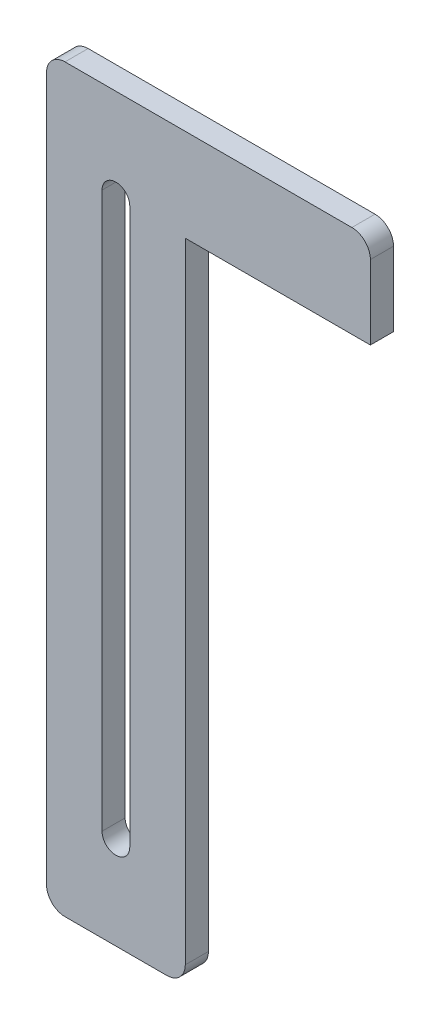
ISO-10303-21;
HEADER;
FILE_DESCRIPTION(('STEP AP214'),'2;1');
FILE_NAME('part.step','',(''),(''),'','','');
FILE_SCHEMA(('AUTOMOTIVE_DESIGN { 1 0 10303 214 1 1 1 1 }'));
ENDSEC;
DATA;
#1=APPLICATION_CONTEXT('core data for automotive mechanical design processes');
#2=APPLICATION_PROTOCOL_DEFINITION('international standard','automotive_design',2000,#1);
#3=PRODUCT_CONTEXT('',#1,'mechanical');
#4=PRODUCT('Part','Part','',(#3));
#5=PRODUCT_RELATED_PRODUCT_CATEGORY('part','',(#4));
#6=PRODUCT_DEFINITION_FORMATION('','',#4);
#7=PRODUCT_DEFINITION_CONTEXT('part definition',#1,'design');
#8=PRODUCT_DEFINITION('design','',#6,#7);
#9=PRODUCT_DEFINITION_SHAPE('','',#8);
#10=(LENGTH_UNIT() NAMED_UNIT(*) SI_UNIT(.MILLI.,.METRE.));
#11=(NAMED_UNIT(*) PLANE_ANGLE_UNIT() SI_UNIT($,.RADIAN.));
#12=(NAMED_UNIT(*) SI_UNIT($,.STERADIAN.) SOLID_ANGLE_UNIT());
#13=UNCERTAINTY_MEASURE_WITH_UNIT(LENGTH_MEASURE(1.E-05),#10,'distance_accuracy_value','');
#14=(GEOMETRIC_REPRESENTATION_CONTEXT(3) GLOBAL_UNCERTAINTY_ASSIGNED_CONTEXT((#13)) GLOBAL_UNIT_ASSIGNED_CONTEXT((#10,
#11,#12)) REPRESENTATION_CONTEXT('',''));
#15=CARTESIAN_POINT('',(0.,0.,0.));
#16=DIRECTION('',(0.,0.,1.));
#17=DIRECTION('',(1.,0.,0.));
#18=AXIS2_PLACEMENT_3D('',#15,#16,#17);
#19=CARTESIAN_POINT('',(0.,0.,3.175));
#20=DIRECTION('',(0.,0.,1.));
#21=DIRECTION('',(1.,0.,0.));
#22=AXIS2_PLACEMENT_3D('',#19,#20,#21);
#23=PLANE('',#22);
#24=DIRECTION('',(1.,0.,0.));
#25=VECTOR('',#24,1.);
#26=CARTESIAN_POINT('',(0.,0.,3.175));
#27=LINE('',#26,#25);
#28=CARTESIAN_POINT('',(2.54,0.,3.175));
#29=VERTEX_POINT('',#28);
#30=CARTESIAN_POINT('',(16.51,0.,3.175));
#31=VERTEX_POINT('',#30);
#32=EDGE_CURVE('E237',#29,#31,#27,.T.);
#33=ORIENTED_EDGE('',*,*,#32,.T.);
#34=CARTESIAN_POINT('',(16.51,2.54,3.175));
#35=DIRECTION('',(0.,0.,1.));
#36=DIRECTION('',(1.,0.,0.));
#37=AXIS2_PLACEMENT_3D('',#34,#35,#36);
#38=CIRCLE('',#37,2.54);
#39=CARTESIAN_POINT('',(19.05,2.54,3.175));
#40=VERTEX_POINT('',#39);
#41=EDGE_CURVE('E192',#31,#40,#38,.T.);
#42=ORIENTED_EDGE('',*,*,#41,.T.);
#43=DIRECTION('',(0.,1.,0.));
#44=VECTOR('',#43,1.);
#45=CARTESIAN_POINT('',(19.05,0.,3.175));
#46=LINE('',#45,#44);
#47=CARTESIAN_POINT('',(19.05,88.9,3.175));
#48=VERTEX_POINT('',#47);
#49=EDGE_CURVE('E183',#40,#48,#46,.T.);
#50=ORIENTED_EDGE('',*,*,#49,.T.);
#51=DIRECTION('',(1.,0.,0.));
#52=VECTOR('',#51,1.);
#53=CARTESIAN_POINT('',(0.,88.9,3.175));
#54=LINE('',#53,#52);
#55=CARTESIAN_POINT('',(44.45,88.9,3.175));
#56=VERTEX_POINT('',#55);
#57=EDGE_CURVE('E189',#48,#56,#54,.T.);
#58=ORIENTED_EDGE('',*,*,#57,.T.);
#59=DIRECTION('',(0.,-1.,0.));
#60=VECTOR('',#59,1.);
#61=CARTESIAN_POINT('',(44.45,0.,3.175));
#62=LINE('',#61,#60);
#63=CARTESIAN_POINT('',(44.45,99.06,3.175));
#64=VERTEX_POINT('',#63);
#65=EDGE_CURVE('E216',#64,#56,#62,.T.);
#66=ORIENTED_EDGE('',*,*,#65,.F.);
#67=CARTESIAN_POINT('',(41.91,99.06,3.175));
#68=DIRECTION('',(0.,0.,1.));
#69=DIRECTION('',(1.,0.,0.));
#70=AXIS2_PLACEMENT_3D('',#67,#68,#69);
#71=CIRCLE('',#70,2.54);
#72=CARTESIAN_POINT('',(41.91,101.6,3.175));
#73=VERTEX_POINT('',#72);
#74=EDGE_CURVE('E258',#64,#73,#71,.T.);
#75=ORIENTED_EDGE('',*,*,#74,.T.);
#76=DIRECTION('',(1.,0.,0.));
#77=VECTOR('',#76,1.);
#78=CARTESIAN_POINT('',(0.,101.6,3.175));
#79=LINE('',#78,#77);
#80=CARTESIAN_POINT('',(2.53999999999998,101.6,3.175));
#81=VERTEX_POINT('',#80);
#82=EDGE_CURVE('E212',#81,#73,#79,.T.);
#83=ORIENTED_EDGE('',*,*,#82,.F.);
#84=CARTESIAN_POINT('',(2.53999999999998,99.06,3.175));
#85=DIRECTION('',(0.,0.,1.));
#86=DIRECTION('',(1.,0.,0.));
#87=AXIS2_PLACEMENT_3D('',#84,#85,#86);
#88=CIRCLE('',#87,2.54);
#89=CARTESIAN_POINT('',(0.,99.06,3.175));
#90=VERTEX_POINT('',#89);
#91=EDGE_CURVE('E97',#81,#90,#88,.T.);
#92=ORIENTED_EDGE('',*,*,#91,.T.);
#93=DIRECTION('',(0.,1.,0.));
#94=VECTOR('',#93,1.);
#95=CARTESIAN_POINT('',(0.,0.,3.175));
#96=LINE('',#95,#94);
#97=CARTESIAN_POINT('',(0.,2.54,3.175));
#98=VERTEX_POINT('',#97);
#99=EDGE_CURVE('E196',#98,#90,#96,.T.);
#100=ORIENTED_EDGE('',*,*,#99,.F.);
#101=CARTESIAN_POINT('',(2.54,2.54,3.175));
#102=DIRECTION('',(0.,0.,1.));
#103=DIRECTION('',(1.,0.,0.));
#104=AXIS2_PLACEMENT_3D('',#101,#102,#103);
#105=CIRCLE('',#104,2.54);
#106=EDGE_CURVE('E264',#98,#29,#105,.T.);
#107=ORIENTED_EDGE('',*,*,#106,.T.);
#108=EDGE_LOOP('',(#33,#42,#50,#58,#66,#75,#83,#92,#100,#107));
#109=FACE_BOUND('',#108,.T.);
#110=DIRECTION('',(0.,-1.,0.));
#111=VECTOR('',#110,1.);
#112=CARTESIAN_POINT('',(7.62,0.,3.175));
#113=LINE('',#112,#111);
#114=CARTESIAN_POINT('',(7.61999999999999,88.9,3.175));
#115=VERTEX_POINT('',#114);
#116=CARTESIAN_POINT('',(7.62,12.7,3.175));
#117=VERTEX_POINT('',#116);
#118=EDGE_CURVE('E290',#115,#117,#113,.T.);
#119=ORIENTED_EDGE('',*,*,#118,.F.);
#120=CARTESIAN_POINT('',(9.52499999999999,88.9,3.175));
#121=DIRECTION('',(0.,0.,1.));
#122=DIRECTION('',(1.,0.,0.));
#123=AXIS2_PLACEMENT_3D('',#120,#121,#122);
#124=CIRCLE('',#123,1.905);
#125=CARTESIAN_POINT('',(11.43,88.9,3.175));
#126=VERTEX_POINT('',#125);
#127=EDGE_CURVE('E298',#126,#115,#124,.T.);
#128=ORIENTED_EDGE('',*,*,#127,.F.);
#129=DIRECTION('',(0.,-1.,0.));
#130=VECTOR('',#129,1.);
#131=CARTESIAN_POINT('',(11.43,0.,3.175));
#132=LINE('',#131,#130);
#133=CARTESIAN_POINT('',(11.43,12.7,3.175));
#134=VERTEX_POINT('',#133);
#135=EDGE_CURVE('E295',#126,#134,#132,.T.);
#136=ORIENTED_EDGE('',*,*,#135,.T.);
#137=CARTESIAN_POINT('',(9.525,12.7,3.175));
#138=DIRECTION('',(0.,0.,1.));
#139=DIRECTION('',(1.,0.,0.));
#140=AXIS2_PLACEMENT_3D('',#137,#138,#139);
#141=CIRCLE('',#140,1.905);
#142=EDGE_CURVE('E292',#117,#134,#141,.T.);
#143=ORIENTED_EDGE('',*,*,#142,.F.);
#144=EDGE_LOOP('',(#119,#128,#136,#143));
#145=FACE_BOUND('',#144,.T.);
#146=ADVANCED_FACE('F82',(#109,#145),#23,.T.);
#147=CARTESIAN_POINT('',(44.45,0.,3.175));
#148=DIRECTION('',(1.,0.,0.));
#149=DIRECTION('',(0.,0.,-1.));
#150=AXIS2_PLACEMENT_3D('',#147,#148,#149);
#151=PLANE('',#150);
#152=DIRECTION('',(0.,-1.,0.));
#153=VECTOR('',#152,1.);
#154=CARTESIAN_POINT('',(44.45,0.,0.));
#155=LINE('',#154,#153);
#156=CARTESIAN_POINT('',(44.45,99.06,0.));
#157=VERTEX_POINT('',#156);
#158=CARTESIAN_POINT('',(44.45,88.9,0.));
#159=VERTEX_POINT('',#158);
#160=EDGE_CURVE('E238',#157,#159,#155,.T.);
#161=ORIENTED_EDGE('',*,*,#160,.F.);
#162=DIRECTION('',(0.,0.,-1.));
#163=VECTOR('',#162,1.);
#164=CARTESIAN_POINT('',(44.45,99.06,3.175));
#165=LINE('',#164,#163);
#166=EDGE_CURVE('E12',#157,#64,#165,.F.);
#167=ORIENTED_EDGE('',*,*,#166,.T.);
#168=ORIENTED_EDGE('',*,*,#65,.T.);
#169=DIRECTION('',(0.,0.,-1.));
#170=VECTOR('',#169,1.);
#171=CARTESIAN_POINT('',(44.45,88.9,3.175));
#172=LINE('',#171,#170);
#173=EDGE_CURVE('E208',#56,#159,#172,.T.);
#174=ORIENTED_EDGE('',*,*,#173,.T.);
#175=EDGE_LOOP('',(#161,#167,#168,#174));
#176=FACE_BOUND('',#175,.T.);
#177=ADVANCED_FACE('F343',(#176),#151,.T.);
#178=CARTESIAN_POINT('',(0.,0.,0.));
#179=DIRECTION('',(0.,0.,1.));
#180=DIRECTION('',(1.,0.,0.));
#181=AXIS2_PLACEMENT_3D('',#178,#179,#180);
#182=PLANE('',#181);
#183=DIRECTION('',(0.,1.,0.));
#184=VECTOR('',#183,1.);
#185=CARTESIAN_POINT('',(19.05,0.,0.));
#186=LINE('',#185,#184);
#187=CARTESIAN_POINT('',(19.05,2.54,0.));
#188=VERTEX_POINT('',#187);
#189=CARTESIAN_POINT('',(19.05,88.9,0.));
#190=VERTEX_POINT('',#189);
#191=EDGE_CURVE('E203',#188,#190,#186,.T.);
#192=ORIENTED_EDGE('',*,*,#191,.F.);
#193=CARTESIAN_POINT('',(16.51,2.54,0.));
#194=DIRECTION('',(0.,0.,1.));
#195=DIRECTION('',(1.,0.,0.));
#196=AXIS2_PLACEMENT_3D('',#193,#194,#195);
#197=CIRCLE('',#196,2.54);
#198=CARTESIAN_POINT('',(16.51,0.,0.));
#199=VERTEX_POINT('',#198);
#200=EDGE_CURVE('E256',#188,#199,#197,.F.);
#201=ORIENTED_EDGE('',*,*,#200,.T.);
#202=DIRECTION('',(1.,0.,0.));
#203=VECTOR('',#202,1.);
#204=CARTESIAN_POINT('',(0.,0.,0.));
#205=LINE('',#204,#203);
#206=CARTESIAN_POINT('',(2.54,0.,0.));
#207=VERTEX_POINT('',#206);
#208=EDGE_CURVE('E197',#207,#199,#205,.T.);
#209=ORIENTED_EDGE('',*,*,#208,.F.);
#210=CARTESIAN_POINT('',(2.54,2.54,0.));
#211=DIRECTION('',(0.,0.,1.));
#212=DIRECTION('',(1.,0.,0.));
#213=AXIS2_PLACEMENT_3D('',#210,#211,#212);
#214=CIRCLE('',#213,2.54);
#215=CARTESIAN_POINT('',(0.,2.54,0.));
#216=VERTEX_POINT('',#215);
#217=EDGE_CURVE('E377',#207,#216,#214,.F.);
#218=ORIENTED_EDGE('',*,*,#217,.T.);
#219=DIRECTION('',(0.,1.,0.));
#220=VECTOR('',#219,1.);
#221=CARTESIAN_POINT('',(0.,0.,0.));
#222=LINE('',#221,#220);
#223=CARTESIAN_POINT('',(0.,99.06,0.));
#224=VERTEX_POINT('',#223);
#225=EDGE_CURVE('E241',#216,#224,#222,.T.);
#226=ORIENTED_EDGE('',*,*,#225,.T.);
#227=CARTESIAN_POINT('',(2.53999999999998,99.06,0.));
#228=DIRECTION('',(0.,0.,1.));
#229=DIRECTION('',(1.,0.,0.));
#230=AXIS2_PLACEMENT_3D('',#227,#228,#229);
#231=CIRCLE('',#230,2.54);
#232=CARTESIAN_POINT('',(2.53999999999998,101.6,0.));
#233=VERTEX_POINT('',#232);
#234=EDGE_CURVE('E285',#224,#233,#231,.F.);
#235=ORIENTED_EDGE('',*,*,#234,.T.);
#236=DIRECTION('',(1.,0.,0.));
#237=VECTOR('',#236,1.);
#238=CARTESIAN_POINT('',(0.,101.6,0.));
#239=LINE('',#238,#237);
#240=CARTESIAN_POINT('',(41.91,101.6,0.));
#241=VERTEX_POINT('',#240);
#242=EDGE_CURVE('E225',#233,#241,#239,.T.);
#243=ORIENTED_EDGE('',*,*,#242,.T.);
#244=CARTESIAN_POINT('',(41.91,99.06,0.));
#245=DIRECTION('',(0.,0.,1.));
#246=DIRECTION('',(1.,0.,0.));
#247=AXIS2_PLACEMENT_3D('',#244,#245,#246);
#248=CIRCLE('',#247,2.54);
#249=EDGE_CURVE('E283',#241,#157,#248,.F.);
#250=ORIENTED_EDGE('',*,*,#249,.T.);
#251=ORIENTED_EDGE('',*,*,#160,.T.);
#252=DIRECTION('',(1.,0.,0.));
#253=VECTOR('',#252,1.);
#254=CARTESIAN_POINT('',(0.,88.9,0.));
#255=LINE('',#254,#253);
#256=EDGE_CURVE('E223',#190,#159,#255,.T.);
#257=ORIENTED_EDGE('',*,*,#256,.F.);
#258=EDGE_LOOP('',(#192,#201,#209,#218,#226,#235,#243,#250,#251,#257));
#259=FACE_BOUND('',#258,.T.);
#260=CARTESIAN_POINT('',(9.52499999999999,88.9,0.));
#261=DIRECTION('',(0.,0.,1.));
#262=DIRECTION('',(1.,0.,0.));
#263=AXIS2_PLACEMENT_3D('',#260,#261,#262);
#264=CIRCLE('',#263,1.905);
#265=CARTESIAN_POINT('',(11.43,88.9,0.));
#266=VERTEX_POINT('',#265);
#267=CARTESIAN_POINT('',(7.61999999999999,88.9,0.));
#268=VERTEX_POINT('',#267);
#269=EDGE_CURVE('E293',#266,#268,#264,.T.);
#270=ORIENTED_EDGE('',*,*,#269,.T.);
#271=DIRECTION('',(0.,-1.,0.));
#272=VECTOR('',#271,1.);
#273=CARTESIAN_POINT('',(7.62,0.,0.));
#274=LINE('',#273,#272);
#275=CARTESIAN_POINT('',(7.62,12.7,0.));
#276=VERTEX_POINT('',#275);
#277=EDGE_CURVE('E301',#268,#276,#274,.T.);
#278=ORIENTED_EDGE('',*,*,#277,.T.);
#279=CARTESIAN_POINT('',(9.525,12.7,0.));
#280=DIRECTION('',(0.,0.,1.));
#281=DIRECTION('',(1.,0.,0.));
#282=AXIS2_PLACEMENT_3D('',#279,#280,#281);
#283=CIRCLE('',#282,1.905);
#284=CARTESIAN_POINT('',(11.43,12.7,0.));
#285=VERTEX_POINT('',#284);
#286=EDGE_CURVE('E304',#276,#285,#283,.T.);
#287=ORIENTED_EDGE('',*,*,#286,.T.);
#288=DIRECTION('',(0.,-1.,0.));
#289=VECTOR('',#288,1.);
#290=CARTESIAN_POINT('',(11.43,0.,0.));
#291=LINE('',#290,#289);
#292=EDGE_CURVE('E307',#266,#285,#291,.T.);
#293=ORIENTED_EDGE('',*,*,#292,.F.);
#294=EDGE_LOOP('',(#270,#278,#287,#293));
#295=FACE_BOUND('',#294,.T.);
#296=ADVANCED_FACE('F281',(#259,#295),#182,.F.);
#297=CARTESIAN_POINT('',(0.,88.9,3.175));
#298=DIRECTION('',(0.,1.,0.));
#299=DIRECTION('',(-1.,0.,0.));
#300=AXIS2_PLACEMENT_3D('',#297,#298,#299);
#301=PLANE('',#300);
#302=ORIENTED_EDGE('',*,*,#256,.T.);
#303=ORIENTED_EDGE('',*,*,#173,.F.);
#304=ORIENTED_EDGE('',*,*,#57,.F.);
#305=DIRECTION('',(0.,0.,-1.));
#306=VECTOR('',#305,1.);
#307=CARTESIAN_POINT('',(19.05,88.9,3.175));
#308=LINE('',#307,#306);
#309=EDGE_CURVE('E200',#48,#190,#308,.T.);
#310=ORIENTED_EDGE('',*,*,#309,.T.);
#311=EDGE_LOOP('',(#302,#303,#304,#310));
#312=FACE_BOUND('',#311,.T.);
#313=ADVANCED_FACE('F210',(#312),#301,.F.);
#314=CARTESIAN_POINT('',(0.,101.6,3.175));
#315=DIRECTION('',(0.,1.,0.));
#316=DIRECTION('',(0.,0.,1.));
#317=AXIS2_PLACEMENT_3D('',#314,#315,#316);
#318=PLANE('',#317);
#319=ORIENTED_EDGE('',*,*,#82,.T.);
#320=DIRECTION('',(0.,0.,-1.));
#321=VECTOR('',#320,1.);
#322=CARTESIAN_POINT('',(41.91,101.6,3.175));
#323=LINE('',#322,#321);
#324=EDGE_CURVE('E90',#73,#241,#323,.T.);
#325=ORIENTED_EDGE('',*,*,#324,.T.);
#326=ORIENTED_EDGE('',*,*,#242,.F.);
#327=DIRECTION('',(0.,0.,-1.));
#328=VECTOR('',#327,1.);
#329=CARTESIAN_POINT('',(2.53999999999998,101.6,3.175));
#330=LINE('',#329,#328);
#331=EDGE_CURVE('E271',#233,#81,#330,.F.);
#332=ORIENTED_EDGE('',*,*,#331,.T.);
#333=EDGE_LOOP('',(#319,#325,#326,#332));
#334=FACE_BOUND('',#333,.T.);
#335=ADVANCED_FACE('F277',(#334),#318,.T.);
#336=CARTESIAN_POINT('',(9.525,12.7,3.175));
#337=DIRECTION('',(0.,0.,-1.));
#338=DIRECTION('',(-1.,0.,0.));
#339=AXIS2_PLACEMENT_3D('',#336,#337,#338);
#340=CYLINDRICAL_SURFACE('',#339,1.905);
#341=ORIENTED_EDGE('',*,*,#286,.F.);
#342=DIRECTION('',(0.,0.,-1.));
#343=VECTOR('',#342,1.);
#344=CARTESIAN_POINT('',(7.62,12.7,3.175));
#345=LINE('',#344,#343);
#346=EDGE_CURVE('E234',#117,#276,#345,.T.);
#347=ORIENTED_EDGE('',*,*,#346,.F.);
#348=ORIENTED_EDGE('',*,*,#142,.T.);
#349=DIRECTION('',(0.,0.,-1.));
#350=VECTOR('',#349,1.);
#351=CARTESIAN_POINT('',(11.43,12.7,3.175));
#352=LINE('',#351,#350);
#353=EDGE_CURVE('E315',#134,#285,#352,.T.);
#354=ORIENTED_EDGE('',*,*,#353,.T.);
#355=EDGE_LOOP('',(#341,#347,#348,#354));
#356=FACE_BOUND('',#355,.T.);
#357=ADVANCED_FACE('F331',(#356),#340,.F.);
#358=CARTESIAN_POINT('',(11.43,0.,3.175));
#359=DIRECTION('',(1.,0.,0.));
#360=DIRECTION('',(0.,1.,0.));
#361=AXIS2_PLACEMENT_3D('',#358,#359,#360);
#362=PLANE('',#361);
#363=ORIENTED_EDGE('',*,*,#292,.T.);
#364=ORIENTED_EDGE('',*,*,#353,.F.);
#365=ORIENTED_EDGE('',*,*,#135,.F.);
#366=DIRECTION('',(0.,0.,-1.));
#367=VECTOR('',#366,1.);
#368=CARTESIAN_POINT('',(11.43,88.9,3.175));
#369=LINE('',#368,#367);
#370=EDGE_CURVE('E314',#126,#266,#369,.T.);
#371=ORIENTED_EDGE('',*,*,#370,.T.);
#372=EDGE_LOOP('',(#363,#364,#365,#371));
#373=FACE_BOUND('',#372,.T.);
#374=ADVANCED_FACE('F333',(#373),#362,.F.);
#375=CARTESIAN_POINT('',(9.52499999999999,88.9,3.175));
#376=DIRECTION('',(0.,0.,-1.));
#377=DIRECTION('',(-1.,0.,0.));
#378=AXIS2_PLACEMENT_3D('',#375,#376,#377);
#379=CYLINDRICAL_SURFACE('',#378,1.905);
#380=ORIENTED_EDGE('',*,*,#269,.F.);
#381=ORIENTED_EDGE('',*,*,#370,.F.);
#382=ORIENTED_EDGE('',*,*,#127,.T.);
#383=DIRECTION('',(0.,0.,-1.));
#384=VECTOR('',#383,1.);
#385=CARTESIAN_POINT('',(7.61999999999999,88.9,3.175));
#386=LINE('',#385,#384);
#387=EDGE_CURVE('E300',#115,#268,#386,.T.);
#388=ORIENTED_EDGE('',*,*,#387,.T.);
#389=EDGE_LOOP('',(#380,#381,#382,#388));
#390=FACE_BOUND('',#389,.T.);
#391=ADVANCED_FACE('F329',(#390),#379,.F.);
#392=CARTESIAN_POINT('',(7.62,0.,3.175));
#393=DIRECTION('',(1.,0.,0.));
#394=DIRECTION('',(0.,1.,0.));
#395=AXIS2_PLACEMENT_3D('',#392,#393,#394);
#396=PLANE('',#395);
#397=ORIENTED_EDGE('',*,*,#277,.F.);
#398=ORIENTED_EDGE('',*,*,#387,.F.);
#399=ORIENTED_EDGE('',*,*,#118,.T.);
#400=ORIENTED_EDGE('',*,*,#346,.T.);
#401=EDGE_LOOP('',(#397,#398,#399,#400));
#402=FACE_BOUND('',#401,.T.);
#403=ADVANCED_FACE('F321',(#402),#396,.T.);
#404=CARTESIAN_POINT('',(0.,0.,3.175));
#405=DIRECTION('',(-1.,0.,0.));
#406=DIRECTION('',(0.,-1.,0.));
#407=AXIS2_PLACEMENT_3D('',#404,#405,#406);
#408=PLANE('',#407);
#409=ORIENTED_EDGE('',*,*,#225,.F.);
#410=DIRECTION('',(0.,0.,-1.));
#411=VECTOR('',#410,1.);
#412=CARTESIAN_POINT('',(0.,2.54,3.175));
#413=LINE('',#412,#411);
#414=EDGE_CURVE('E104',#216,#98,#413,.F.);
#415=ORIENTED_EDGE('',*,*,#414,.T.);
#416=ORIENTED_EDGE('',*,*,#99,.T.);
#417=DIRECTION('',(0.,0.,-1.));
#418=VECTOR('',#417,1.);
#419=CARTESIAN_POINT('',(0.,99.06,3.175));
#420=LINE('',#419,#418);
#421=EDGE_CURVE('E267',#90,#224,#420,.T.);
#422=ORIENTED_EDGE('',*,*,#421,.T.);
#423=EDGE_LOOP('',(#409,#415,#416,#422));
#424=FACE_BOUND('',#423,.T.);
#425=ADVANCED_FACE('F360',(#424),#408,.T.);
#426=CARTESIAN_POINT('',(0.,0.,3.175));
#427=DIRECTION('',(0.,1.,0.));
#428=DIRECTION('',(-1.,0.,0.));
#429=AXIS2_PLACEMENT_3D('',#426,#427,#428);
#430=PLANE('',#429);
#431=ORIENTED_EDGE('',*,*,#208,.T.);
#432=DIRECTION('',(0.,0.,-1.));
#433=VECTOR('',#432,1.);
#434=CARTESIAN_POINT('',(16.51,0.,3.175));
#435=LINE('',#434,#433);
#436=EDGE_CURVE('E250',#199,#31,#435,.F.);
#437=ORIENTED_EDGE('',*,*,#436,.T.);
#438=ORIENTED_EDGE('',*,*,#32,.F.);
#439=DIRECTION('',(0.,0.,-1.));
#440=VECTOR('',#439,1.);
#441=CARTESIAN_POINT('',(2.54,0.,0.));
#442=LINE('',#441,#440);
#443=EDGE_CURVE('E252',#29,#207,#442,.T.);
#444=ORIENTED_EDGE('',*,*,#443,.T.);
#445=EDGE_LOOP('',(#431,#437,#438,#444));
#446=FACE_BOUND('',#445,.T.);
#447=ADVANCED_FACE('F248',(#446),#430,.F.);
#448=CARTESIAN_POINT('',(19.05,0.,3.175));
#449=DIRECTION('',(-1.,0.,0.));
#450=DIRECTION('',(0.,-1.,0.));
#451=AXIS2_PLACEMENT_3D('',#448,#449,#450);
#452=PLANE('',#451);
#453=ORIENTED_EDGE('',*,*,#49,.F.);
#454=DIRECTION('',(0.,0.,-1.));
#455=VECTOR('',#454,1.);
#456=CARTESIAN_POINT('',(19.05,2.54,3.175));
#457=LINE('',#456,#455);
#458=EDGE_CURVE('E207',#40,#188,#457,.T.);
#459=ORIENTED_EDGE('',*,*,#458,.T.);
#460=ORIENTED_EDGE('',*,*,#191,.T.);
#461=ORIENTED_EDGE('',*,*,#309,.F.);
#462=EDGE_LOOP('',(#453,#459,#460,#461));
#463=FACE_BOUND('',#462,.T.);
#464=ADVANCED_FACE('F201',(#463),#452,.F.);
#465=CARTESIAN_POINT('',(16.51,2.54,3.175));
#466=DIRECTION('',(0.,0.,-1.));
#467=DIRECTION('',(-1.,0.,0.));
#468=AXIS2_PLACEMENT_3D('',#465,#466,#467);
#469=CYLINDRICAL_SURFACE('',#468,2.54);
#470=ORIENTED_EDGE('',*,*,#41,.F.);
#471=ORIENTED_EDGE('',*,*,#436,.F.);
#472=ORIENTED_EDGE('',*,*,#200,.F.);
#473=ORIENTED_EDGE('',*,*,#458,.F.);
#474=EDGE_LOOP('',(#470,#471,#472,#473));
#475=FACE_BOUND('',#474,.T.);
#476=ADVANCED_FACE('F255',(#475),#469,.T.);
#477=CARTESIAN_POINT('',(2.54,2.54,3.175));
#478=DIRECTION('',(0.,0.,1.));
#479=DIRECTION('',(1.,0.,0.));
#480=AXIS2_PLACEMENT_3D('',#477,#478,#479);
#481=CYLINDRICAL_SURFACE('',#480,2.54);
#482=ORIENTED_EDGE('',*,*,#106,.F.);
#483=ORIENTED_EDGE('',*,*,#414,.F.);
#484=ORIENTED_EDGE('',*,*,#217,.F.);
#485=ORIENTED_EDGE('',*,*,#443,.F.);
#486=EDGE_LOOP('',(#482,#483,#484,#485));
#487=FACE_BOUND('',#486,.T.);
#488=ADVANCED_FACE('F365',(#487),#481,.T.);
#489=CARTESIAN_POINT('',(41.91,99.06,3.175));
#490=DIRECTION('',(0.,0.,-1.));
#491=DIRECTION('',(-1.,0.,0.));
#492=AXIS2_PLACEMENT_3D('',#489,#490,#491);
#493=CYLINDRICAL_SURFACE('',#492,2.54);
#494=ORIENTED_EDGE('',*,*,#74,.F.);
#495=ORIENTED_EDGE('',*,*,#166,.F.);
#496=ORIENTED_EDGE('',*,*,#249,.F.);
#497=ORIENTED_EDGE('',*,*,#324,.F.);
#498=EDGE_LOOP('',(#494,#495,#496,#497));
#499=FACE_BOUND('',#498,.T.);
#500=ADVANCED_FACE('F384',(#499),#493,.T.);
#501=CARTESIAN_POINT('',(2.53999999999998,99.06,3.175));
#502=DIRECTION('',(0.,0.,-1.));
#503=DIRECTION('',(-1.,0.,0.));
#504=AXIS2_PLACEMENT_3D('',#501,#502,#503);
#505=CYLINDRICAL_SURFACE('',#504,2.54);
#506=ORIENTED_EDGE('',*,*,#91,.F.);
#507=ORIENTED_EDGE('',*,*,#331,.F.);
#508=ORIENTED_EDGE('',*,*,#234,.F.);
#509=ORIENTED_EDGE('',*,*,#421,.F.);
#510=EDGE_LOOP('',(#506,#507,#508,#509));
#511=FACE_BOUND('',#510,.T.);
#512=ADVANCED_FACE('F84',(#511),#505,.T.);
#513=CLOSED_SHELL('',(#146,#177,#296,#313,#335,#357,#374,#391,#403,#425,#447,#464,#476,#488,
#500,#512));
#514=MANIFOLD_SOLID_BREP('B2',#513);
#515=ADVANCED_BREP_SHAPE_REPRESENTATION('',(#18,#514),#14);
#516=SHAPE_DEFINITION_REPRESENTATION(#9,#515);
ENDSEC;
END-ISO-10303-21;
